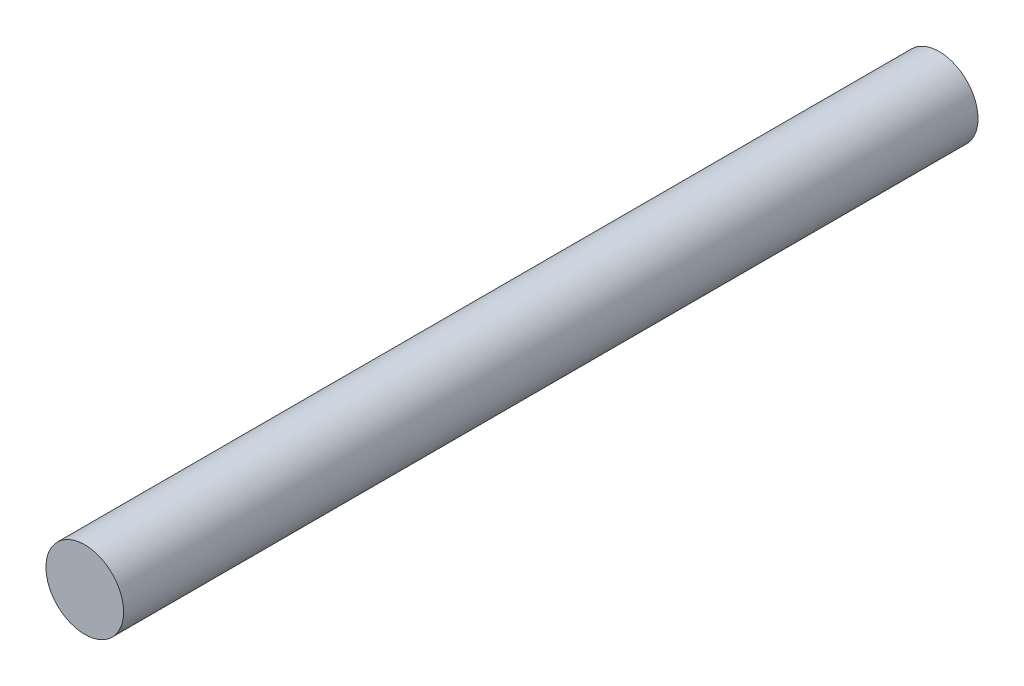
ISO-10303-21;
HEADER;
FILE_DESCRIPTION(('STEP AP214'),'2;1');
FILE_NAME('part.step','',(''),(''),'','','');
FILE_SCHEMA(('AUTOMOTIVE_DESIGN { 1 0 10303 214 1 1 1 1 }'));
ENDSEC;
DATA;
#1=APPLICATION_CONTEXT('core data for automotive mechanical design processes');
#2=APPLICATION_PROTOCOL_DEFINITION('international standard','automotive_design',2000,#1);
#3=PRODUCT_CONTEXT('',#1,'mechanical');
#4=PRODUCT('Part','Part','',(#3));
#5=PRODUCT_RELATED_PRODUCT_CATEGORY('part','',(#4));
#6=PRODUCT_DEFINITION_FORMATION('','',#4);
#7=PRODUCT_DEFINITION_CONTEXT('part definition',#1,'design');
#8=PRODUCT_DEFINITION('design','',#6,#7);
#9=PRODUCT_DEFINITION_SHAPE('','',#8);
#10=(LENGTH_UNIT() NAMED_UNIT(*) SI_UNIT(.MILLI.,.METRE.));
#11=(NAMED_UNIT(*) PLANE_ANGLE_UNIT() SI_UNIT($,.RADIAN.));
#12=(NAMED_UNIT(*) SI_UNIT($,.STERADIAN.) SOLID_ANGLE_UNIT());
#13=UNCERTAINTY_MEASURE_WITH_UNIT(LENGTH_MEASURE(1.E-05),#10,'distance_accuracy_value','');
#14=(GEOMETRIC_REPRESENTATION_CONTEXT(3) GLOBAL_UNCERTAINTY_ASSIGNED_CONTEXT((#13)) GLOBAL_UNIT_ASSIGNED_CONTEXT((#10,
#11,#12)) REPRESENTATION_CONTEXT('',''));
#15=CARTESIAN_POINT('',(0.,0.,0.));
#16=DIRECTION('',(0.,0.,1.));
#17=DIRECTION('',(1.,0.,0.));
#18=AXIS2_PLACEMENT_3D('',#15,#16,#17);
#19=CARTESIAN_POINT('',(0.,0.,22.));
#20=DIRECTION('',(0.,0.,-1.));
#21=DIRECTION('',(-1.,0.,0.));
#22=AXIS2_PLACEMENT_3D('',#19,#20,#21);
#23=CYLINDRICAL_SURFACE('',#22,1.);
#24=CARTESIAN_POINT('',(0.,0.,22.));
#25=DIRECTION('',(0.,0.,1.));
#26=DIRECTION('',(1.,0.,0.));
#27=AXIS2_PLACEMENT_3D('',#24,#25,#26);
#28=CIRCLE('',#27,1.);
#29=CARTESIAN_POINT('',(1.,0.,22.));
#30=VERTEX_POINT('',#29);
#31=EDGE_CURVE('E10',#30,#30,#28,.T.);
#32=ORIENTED_EDGE('',*,*,#31,.F.);
#33=EDGE_LOOP('',(#32));
#34=FACE_BOUND('',#33,.T.);
#35=CARTESIAN_POINT('',(0.,0.,0.));
#36=DIRECTION('',(0.,0.,1.));
#37=DIRECTION('',(1.,0.,0.));
#38=AXIS2_PLACEMENT_3D('',#35,#36,#37);
#39=CIRCLE('',#38,1.);
#40=CARTESIAN_POINT('',(1.,0.,0.));
#41=VERTEX_POINT('',#40);
#42=EDGE_CURVE('E40',#41,#41,#39,.T.);
#43=ORIENTED_EDGE('',*,*,#42,.T.);
#44=EDGE_LOOP('',(#43));
#45=FACE_BOUND('',#44,.T.);
#46=ADVANCED_FACE('F37',(#34,#45),#23,.T.);
#47=CARTESIAN_POINT('',(0.,0.,22.));
#48=DIRECTION('',(0.,0.,1.));
#49=DIRECTION('',(1.,0.,0.));
#50=AXIS2_PLACEMENT_3D('',#47,#48,#49);
#51=PLANE('',#50);
#52=ORIENTED_EDGE('',*,*,#31,.T.);
#53=EDGE_LOOP('',(#52));
#54=FACE_BOUND('',#53,.T.);
#55=ADVANCED_FACE('F54',(#54),#51,.T.);
#56=CARTESIAN_POINT('',(0.,0.,0.));
#57=DIRECTION('',(0.,0.,1.));
#58=DIRECTION('',(1.,0.,0.));
#59=AXIS2_PLACEMENT_3D('',#56,#57,#58);
#60=PLANE('',#59);
#61=ORIENTED_EDGE('',*,*,#42,.F.);
#62=EDGE_LOOP('',(#61));
#63=FACE_BOUND('',#62,.T.);
#64=ADVANCED_FACE('F52',(#63),#60,.F.);
#65=CLOSED_SHELL('',(#46,#55,#64));
#66=MANIFOLD_SOLID_BREP('B2',#65);
#67=ADVANCED_BREP_SHAPE_REPRESENTATION('',(#18,#66),#14);
#68=SHAPE_DEFINITION_REPRESENTATION(#9,#67);
ENDSEC;
END-ISO-10303-21;
